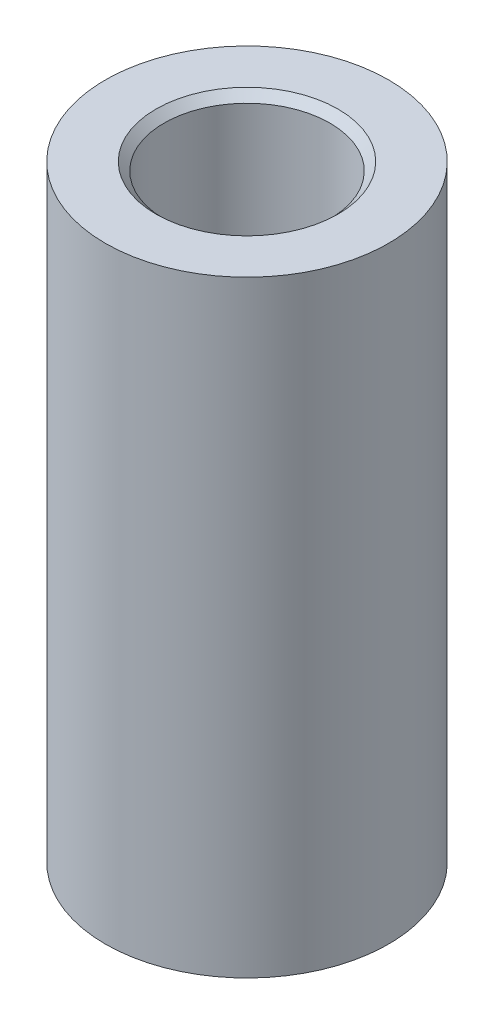
ISO-10303-21;
HEADER;
FILE_DESCRIPTION(('STEP AP214'),'2;1');
FILE_NAME('part.step','',(''),(''),'','','');
FILE_SCHEMA(('AUTOMOTIVE_DESIGN { 1 0 10303 214 1 1 1 1 }'));
ENDSEC;
DATA;
#1=APPLICATION_CONTEXT('core data for automotive mechanical design processes');
#2=APPLICATION_PROTOCOL_DEFINITION('international standard','automotive_design',2000,#1);
#3=PRODUCT_CONTEXT('',#1,'mechanical');
#4=PRODUCT('Part','Part','',(#3));
#5=PRODUCT_RELATED_PRODUCT_CATEGORY('part','',(#4));
#6=PRODUCT_DEFINITION_FORMATION('','',#4);
#7=PRODUCT_DEFINITION_CONTEXT('part definition',#1,'design');
#8=PRODUCT_DEFINITION('design','',#6,#7);
#9=PRODUCT_DEFINITION_SHAPE('','',#8);
#10=(LENGTH_UNIT() NAMED_UNIT(*) SI_UNIT(.MILLI.,.METRE.));
#11=(NAMED_UNIT(*) PLANE_ANGLE_UNIT() SI_UNIT($,.RADIAN.));
#12=(NAMED_UNIT(*) SI_UNIT($,.STERADIAN.) SOLID_ANGLE_UNIT());
#13=UNCERTAINTY_MEASURE_WITH_UNIT(LENGTH_MEASURE(1.E-05),#10,'distance_accuracy_value','');
#14=(GEOMETRIC_REPRESENTATION_CONTEXT(3) GLOBAL_UNCERTAINTY_ASSIGNED_CONTEXT((#13)) GLOBAL_UNIT_ASSIGNED_CONTEXT((#10,
#11,#12)) REPRESENTATION_CONTEXT('',''));
#15=CARTESIAN_POINT('',(0.,0.,0.));
#16=DIRECTION('',(0.,0.,1.));
#17=DIRECTION('',(1.,0.,0.));
#18=AXIS2_PLACEMENT_3D('',#15,#16,#17);
#19=CARTESIAN_POINT('',(0.,15.,0.));
#20=DIRECTION('',(0.,-1.,0.));
#21=DIRECTION('',(0.,0.,-1.));
#22=AXIS2_PLACEMENT_3D('',#19,#20,#21);
#23=CYLINDRICAL_SURFACE('',#22,2.05);
#24=CARTESIAN_POINT('',(0.,0.200000000006639,0.));
#25=DIRECTION('',(0.,-1.,0.));
#26=DIRECTION('',(0.,0.,-1.));
#27=AXIS2_PLACEMENT_3D('',#24,#25,#26);
#28=CIRCLE('',#27,2.04999999994016);
#29=CARTESIAN_POINT('',(0.,0.200000000006639,-2.04999999994016));
#30=VERTEX_POINT('',#29);
#31=EDGE_CURVE('E35',#30,#30,#28,.T.);
#32=ORIENTED_EDGE('',*,*,#31,.T.);
#33=EDGE_LOOP('',(#32));
#34=FACE_BOUND('',#33,.T.);
#35=CARTESIAN_POINT('',(0.,14.8000000000366,0.));
#36=DIRECTION('',(0.,1.,0.));
#37=DIRECTION('',(0.,0.,1.));
#38=AXIS2_PLACEMENT_3D('',#35,#36,#37);
#39=CIRCLE('',#38,2.049999999997);
#40=CARTESIAN_POINT('',(0.,14.8000000000366,2.049999999997));
#41=VERTEX_POINT('',#40);
#42=EDGE_CURVE('E29',#41,#41,#39,.T.);
#43=ORIENTED_EDGE('',*,*,#42,.T.);
#44=EDGE_LOOP('',(#43));
#45=FACE_BOUND('',#44,.T.);
#46=ADVANCED_FACE('F14',(#34,#45),#23,.F.);
#47=CARTESIAN_POINT('',(0.,14.9999999999864,0.));
#48=DIRECTION('',(0.,1.,0.));
#49=DIRECTION('',(0.,0.,1.));
#50=AXIS2_PLACEMENT_3D('',#47,#48,#49);
#51=CONICAL_SURFACE('',#50,2.24999999994679,0.785398163397448);
#52=ORIENTED_EDGE('',*,*,#42,.F.);
#53=EDGE_LOOP('',(#52));
#54=FACE_BOUND('',#53,.T.);
#55=CARTESIAN_POINT('',(0.,15.0000000000432,0.));
#56=DIRECTION('',(0.,1.,0.));
#57=DIRECTION('',(0.,0.,1.));
#58=AXIS2_PLACEMENT_3D('',#55,#56,#57);
#59=CIRCLE('',#58,2.25000000000364);
#60=CARTESIAN_POINT('',(0.,15.0000000000432,2.25000000000364));
#61=VERTEX_POINT('',#60);
#62=EDGE_CURVE('E17',#61,#61,#59,.F.);
#63=ORIENTED_EDGE('',*,*,#62,.F.);
#64=EDGE_LOOP('',(#63));
#65=FACE_BOUND('',#64,.T.);
#66=ADVANCED_FACE('F45',(#54,#65),#51,.F.);
#67=CARTESIAN_POINT('',(0.,0.,0.));
#68=DIRECTION('',(0.,-1.,0.));
#69=DIRECTION('',(0.,0.,-1.));
#70=AXIS2_PLACEMENT_3D('',#67,#68,#69);
#71=CONICAL_SURFACE('',#70,2.25000000000364,0.785398163539557);
#72=CARTESIAN_POINT('',(0.,0.,0.));
#73=DIRECTION('',(0.,-1.,0.));
#74=DIRECTION('',(0.,0.,-1.));
#75=AXIS2_PLACEMENT_3D('',#72,#73,#74);
#76=CIRCLE('',#75,2.25000000000364);
#77=CARTESIAN_POINT('',(0.,0.,-2.25000000000364));
#78=VERTEX_POINT('',#77);
#79=EDGE_CURVE('E26',#78,#78,#76,.T.);
#80=ORIENTED_EDGE('',*,*,#79,.T.);
#81=EDGE_LOOP('',(#80));
#82=FACE_BOUND('',#81,.T.);
#83=ORIENTED_EDGE('',*,*,#31,.F.);
#84=EDGE_LOOP('',(#83));
#85=FACE_BOUND('',#84,.T.);
#86=ADVANCED_FACE('F48',(#82,#85),#71,.F.);
#87=CARTESIAN_POINT('',(0.,15.,0.));
#88=DIRECTION('',(0.,1.,0.));
#89=DIRECTION('',(0.,0.,1.));
#90=AXIS2_PLACEMENT_3D('',#87,#88,#89);
#91=PLANE('',#90);
#92=CARTESIAN_POINT('',(0.,15.,0.));
#93=DIRECTION('',(0.,-1.,0.));
#94=DIRECTION('',(0.,0.,-1.));
#95=AXIS2_PLACEMENT_3D('',#92,#93,#94);
#96=CIRCLE('',#95,3.5);
#97=CARTESIAN_POINT('',(0.,15.,-3.5));
#98=VERTEX_POINT('',#97);
#99=EDGE_CURVE('E21',#98,#98,#96,.T.);
#100=ORIENTED_EDGE('',*,*,#99,.F.);
#101=EDGE_LOOP('',(#100));
#102=FACE_BOUND('',#101,.T.);
#103=ORIENTED_EDGE('',*,*,#62,.T.);
#104=EDGE_LOOP('',(#103));
#105=FACE_BOUND('',#104,.T.);
#106=ADVANCED_FACE('F54',(#102,#105),#91,.T.);
#107=CARTESIAN_POINT('',(0.,0.,0.));
#108=DIRECTION('',(0.,1.,0.));
#109=DIRECTION('',(0.,0.,1.));
#110=AXIS2_PLACEMENT_3D('',#107,#108,#109);
#111=PLANE('',#110);
#112=CARTESIAN_POINT('',(0.,0.,0.));
#113=DIRECTION('',(0.,-1.,0.));
#114=DIRECTION('',(0.,0.,-1.));
#115=AXIS2_PLACEMENT_3D('',#112,#113,#114);
#116=CIRCLE('',#115,3.5);
#117=CARTESIAN_POINT('',(0.,0.,-3.5));
#118=VERTEX_POINT('',#117);
#119=EDGE_CURVE('E8',#118,#118,#116,.F.);
#120=ORIENTED_EDGE('',*,*,#119,.F.);
#121=EDGE_LOOP('',(#120));
#122=FACE_BOUND('',#121,.T.);
#123=ORIENTED_EDGE('',*,*,#79,.F.);
#124=EDGE_LOOP('',(#123));
#125=FACE_BOUND('',#124,.T.);
#126=ADVANCED_FACE('F58',(#122,#125),#111,.F.);
#127=CARTESIAN_POINT('',(0.,15.,0.));
#128=DIRECTION('',(0.,-1.,0.));
#129=DIRECTION('',(0.,0.,-1.));
#130=AXIS2_PLACEMENT_3D('',#127,#128,#129);
#131=CYLINDRICAL_SURFACE('',#130,3.5);
#132=ORIENTED_EDGE('',*,*,#119,.T.);
#133=EDGE_LOOP('',(#132));
#134=FACE_BOUND('',#133,.T.);
#135=ORIENTED_EDGE('',*,*,#99,.T.);
#136=EDGE_LOOP('',(#135));
#137=FACE_BOUND('',#136,.T.);
#138=ADVANCED_FACE('F56',(#134,#137),#131,.T.);
#139=CLOSED_SHELL('',(#46,#66,#86,#106,#126,#138));
#140=MANIFOLD_SOLID_BREP('B1',#139);
#141=ADVANCED_BREP_SHAPE_REPRESENTATION('',(#18,#140),#14);
#142=SHAPE_DEFINITION_REPRESENTATION(#9,#141);
ENDSEC;
END-ISO-10303-21;
